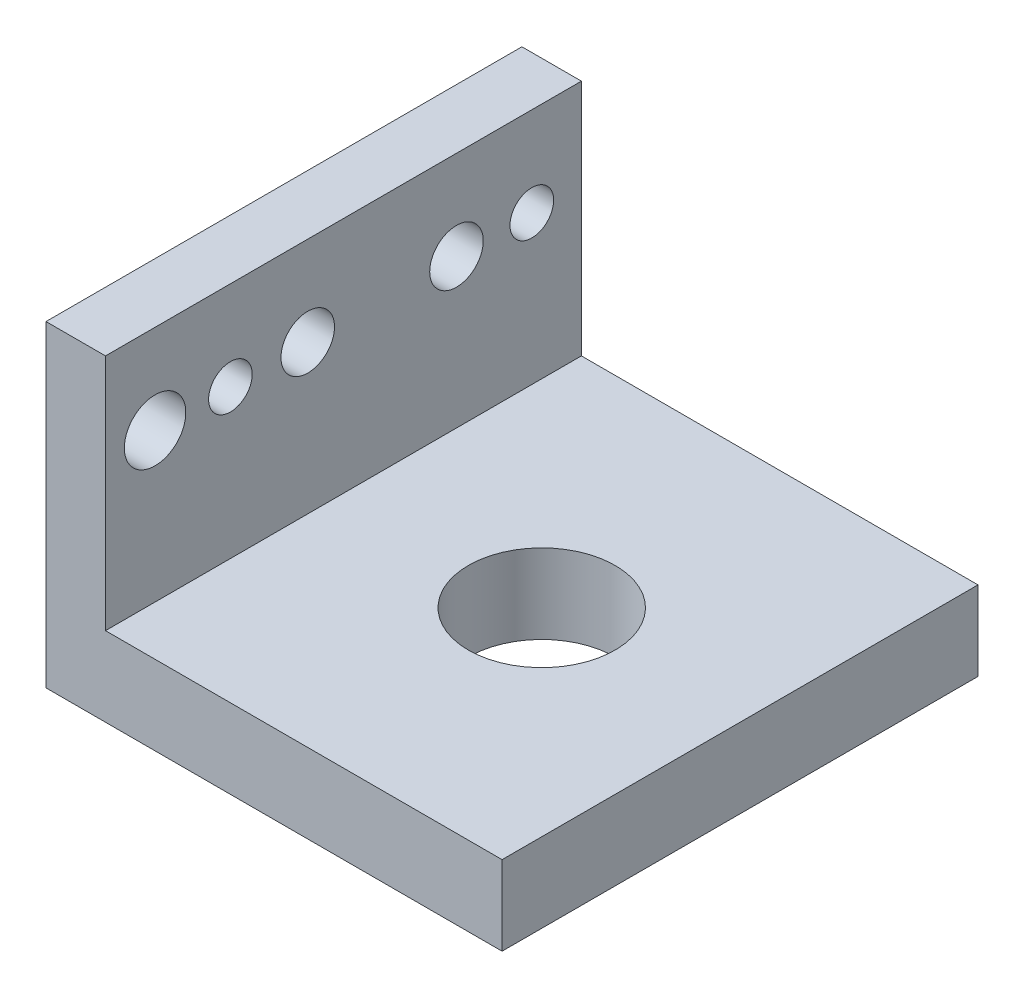
ISO-10303-21;
HEADER;
FILE_DESCRIPTION(('STEP AP214'),'2;1');
FILE_NAME('part.step','',(''),(''),'','','');
FILE_SCHEMA(('AUTOMOTIVE_DESIGN { 1 0 10303 214 1 1 1 1 }'));
ENDSEC;
DATA;
#1=APPLICATION_CONTEXT('core data for automotive mechanical design processes');
#2=APPLICATION_PROTOCOL_DEFINITION('international standard','automotive_design',2000,#1);
#3=PRODUCT_CONTEXT('',#1,'mechanical');
#4=PRODUCT('Part','Part','',(#3));
#5=PRODUCT_RELATED_PRODUCT_CATEGORY('part','',(#4));
#6=PRODUCT_DEFINITION_FORMATION('','',#4);
#7=PRODUCT_DEFINITION_CONTEXT('part definition',#1,'design');
#8=PRODUCT_DEFINITION('design','',#6,#7);
#9=PRODUCT_DEFINITION_SHAPE('','',#8);
#10=(LENGTH_UNIT() NAMED_UNIT(*) SI_UNIT(.MILLI.,.METRE.));
#11=(NAMED_UNIT(*) PLANE_ANGLE_UNIT() SI_UNIT($,.RADIAN.));
#12=(NAMED_UNIT(*) SI_UNIT($,.STERADIAN.) SOLID_ANGLE_UNIT());
#13=UNCERTAINTY_MEASURE_WITH_UNIT(LENGTH_MEASURE(1.E-05),#10,'distance_accuracy_value','');
#14=(GEOMETRIC_REPRESENTATION_CONTEXT(3) GLOBAL_UNCERTAINTY_ASSIGNED_CONTEXT((#13)) GLOBAL_UNIT_ASSIGNED_CONTEXT((#10,
#11,#12)) REPRESENTATION_CONTEXT('',''));
#15=CARTESIAN_POINT('',(0.,0.,0.));
#16=DIRECTION('',(0.,0.,1.));
#17=DIRECTION('',(1.,0.,0.));
#18=AXIS2_PLACEMENT_3D('',#15,#16,#17);
#19=CARTESIAN_POINT('',(0.,4.,0.));
#20=DIRECTION('',(0.,-1.,0.));
#21=DIRECTION('',(0.,0.,-1.));
#22=AXIS2_PLACEMENT_3D('',#19,#20,#21);
#23=PLANE('',#22);
#24=DIRECTION('',(0.,0.,1.));
#25=VECTOR('',#24,1.);
#26=CARTESIAN_POINT('',(0.,4.,0.));
#27=LINE('',#26,#25);
#28=CARTESIAN_POINT('',(0.,4.,-24.));
#29=VERTEX_POINT('',#28);
#30=CARTESIAN_POINT('',(0.,4.,0.));
#31=VERTEX_POINT('',#30);
#32=EDGE_CURVE('E71',#29,#31,#27,.T.);
#33=ORIENTED_EDGE('',*,*,#32,.T.);
#34=DIRECTION('',(1.,0.,0.));
#35=VECTOR('',#34,1.);
#36=CARTESIAN_POINT('',(0.,4.,0.));
#37=LINE('',#36,#35);
#38=CARTESIAN_POINT('',(20.,4.,0.));
#39=VERTEX_POINT('',#38);
#40=EDGE_CURVE('E91',#31,#39,#37,.T.);
#41=ORIENTED_EDGE('',*,*,#40,.T.);
#42=DIRECTION('',(0.,0.,-1.));
#43=VECTOR('',#42,1.);
#44=CARTESIAN_POINT('',(20.,4.,0.));
#45=LINE('',#44,#43);
#46=CARTESIAN_POINT('',(20.,4.,-24.));
#47=VERTEX_POINT('',#46);
#48=EDGE_CURVE('E50',#39,#47,#45,.T.);
#49=ORIENTED_EDGE('',*,*,#48,.T.);
#50=DIRECTION('',(-1.,0.,0.));
#51=VECTOR('',#50,1.);
#52=CARTESIAN_POINT('',(0.,4.,-24.));
#53=LINE('',#52,#51);
#54=EDGE_CURVE('E95',#47,#29,#53,.T.);
#55=ORIENTED_EDGE('',*,*,#54,.T.);
#56=EDGE_LOOP('',(#33,#41,#49,#55));
#57=FACE_BOUND('',#56,.T.);
#58=CARTESIAN_POINT('',(10.,4.,-12.));
#59=DIRECTION('',(0.,1.,0.));
#60=DIRECTION('',(0.,0.,1.));
#61=AXIS2_PLACEMENT_3D('',#58,#59,#60);
#62=CIRCLE('',#61,3.7);
#63=CARTESIAN_POINT('',(10.,4.,-8.3));
#64=VERTEX_POINT('',#63);
#65=EDGE_CURVE('E107',#64,#64,#62,.T.);
#66=ORIENTED_EDGE('',*,*,#65,.F.);
#67=EDGE_LOOP('',(#66));
#68=FACE_BOUND('',#67,.T.);
#69=ADVANCED_FACE('F33',(#57,#68),#23,.F.);
#70=CARTESIAN_POINT('',(0.,0.,0.));
#71=DIRECTION('',(0.,-1.,0.));
#72=DIRECTION('',(0.,0.,-1.));
#73=AXIS2_PLACEMENT_3D('',#70,#71,#72);
#74=PLANE('',#73);
#75=DIRECTION('',(1.,0.,0.));
#76=VECTOR('',#75,1.);
#77=CARTESIAN_POINT('',(0.,0.,0.));
#78=LINE('',#77,#76);
#79=CARTESIAN_POINT('',(-3.,0.,0.));
#80=VERTEX_POINT('',#79);
#81=CARTESIAN_POINT('',(20.,0.,0.));
#82=VERTEX_POINT('',#81);
#83=EDGE_CURVE('E62',#80,#82,#78,.T.);
#84=ORIENTED_EDGE('',*,*,#83,.F.);
#85=DIRECTION('',(0.,0.,1.));
#86=VECTOR('',#85,1.);
#87=CARTESIAN_POINT('',(-3.,0.,-24.));
#88=LINE('',#87,#86);
#89=CARTESIAN_POINT('',(-3.,0.,-24.));
#90=VERTEX_POINT('',#89);
#91=EDGE_CURVE('E121',#90,#80,#88,.T.);
#92=ORIENTED_EDGE('',*,*,#91,.F.);
#93=DIRECTION('',(-1.,0.,0.));
#94=VECTOR('',#93,1.);
#95=CARTESIAN_POINT('',(0.,0.,-24.));
#96=LINE('',#95,#94);
#97=CARTESIAN_POINT('',(20.,0.,-24.));
#98=VERTEX_POINT('',#97);
#99=EDGE_CURVE('E96',#98,#90,#96,.T.);
#100=ORIENTED_EDGE('',*,*,#99,.F.);
#101=DIRECTION('',(0.,0.,-1.));
#102=VECTOR('',#101,1.);
#103=CARTESIAN_POINT('',(20.,0.,0.));
#104=LINE('',#103,#102);
#105=EDGE_CURVE('E98',#82,#98,#104,.T.);
#106=ORIENTED_EDGE('',*,*,#105,.F.);
#107=EDGE_LOOP('',(#84,#92,#100,#106));
#108=FACE_BOUND('',#107,.T.);
#109=CARTESIAN_POINT('',(10.,0.,-12.));
#110=DIRECTION('',(0.,1.,0.));
#111=DIRECTION('',(0.,0.,1.));
#112=AXIS2_PLACEMENT_3D('',#109,#110,#111);
#113=CIRCLE('',#112,3.7);
#114=CARTESIAN_POINT('',(10.,0.,-8.3));
#115=VERTEX_POINT('',#114);
#116=EDGE_CURVE('E101',#115,#115,#113,.T.);
#117=ORIENTED_EDGE('',*,*,#116,.T.);
#118=EDGE_LOOP('',(#117));
#119=FACE_BOUND('',#118,.T.);
#120=ADVANCED_FACE('F118',(#108,#119),#74,.T.);
#121=CARTESIAN_POINT('',(0.,4.,0.));
#122=DIRECTION('',(0.,0.,-1.));
#123=DIRECTION('',(-1.,0.,0.));
#124=AXIS2_PLACEMENT_3D('',#121,#122,#123);
#125=PLANE('',#124);
#126=ORIENTED_EDGE('',*,*,#83,.T.);
#127=DIRECTION('',(0.,-1.,0.));
#128=VECTOR('',#127,1.);
#129=CARTESIAN_POINT('',(20.,4.,0.));
#130=LINE('',#129,#128);
#131=EDGE_CURVE('E11',#39,#82,#130,.T.);
#132=ORIENTED_EDGE('',*,*,#131,.F.);
#133=ORIENTED_EDGE('',*,*,#40,.F.);
#134=DIRECTION('',(0.,1.,0.));
#135=VECTOR('',#134,1.);
#136=CARTESIAN_POINT('',(0.,16.,0.));
#137=LINE('',#136,#135);
#138=CARTESIAN_POINT('',(0.,16.,0.));
#139=VERTEX_POINT('',#138);
#140=EDGE_CURVE('E81',#31,#139,#137,.T.);
#141=ORIENTED_EDGE('',*,*,#140,.T.);
#142=DIRECTION('',(1.,0.,0.));
#143=VECTOR('',#142,1.);
#144=CARTESIAN_POINT('',(-3.,16.,0.));
#145=LINE('',#144,#143);
#146=CARTESIAN_POINT('',(-3.,16.,0.));
#147=VERTEX_POINT('',#146);
#148=EDGE_CURVE('E143',#147,#139,#145,.T.);
#149=ORIENTED_EDGE('',*,*,#148,.F.);
#150=DIRECTION('',(0.,1.,0.));
#151=VECTOR('',#150,1.);
#152=CARTESIAN_POINT('',(-3.,16.,0.));
#153=LINE('',#152,#151);
#154=EDGE_CURVE('E125',#80,#147,#153,.T.);
#155=ORIENTED_EDGE('',*,*,#154,.F.);
#156=EDGE_LOOP('',(#126,#132,#133,#141,#149,#155));
#157=FACE_BOUND('',#156,.T.);
#158=ADVANCED_FACE('F35',(#157),#125,.F.);
#159=CARTESIAN_POINT('',(20.,4.,0.));
#160=DIRECTION('',(-1.,0.,0.));
#161=DIRECTION('',(0.,0.,1.));
#162=AXIS2_PLACEMENT_3D('',#159,#160,#161);
#163=PLANE('',#162);
#164=ORIENTED_EDGE('',*,*,#105,.T.);
#165=DIRECTION('',(0.,-1.,0.));
#166=VECTOR('',#165,1.);
#167=CARTESIAN_POINT('',(20.,4.,-24.));
#168=LINE('',#167,#166);
#169=EDGE_CURVE('E42',#47,#98,#168,.T.);
#170=ORIENTED_EDGE('',*,*,#169,.F.);
#171=ORIENTED_EDGE('',*,*,#48,.F.);
#172=ORIENTED_EDGE('',*,*,#131,.T.);
#173=EDGE_LOOP('',(#164,#170,#171,#172));
#174=FACE_BOUND('',#173,.T.);
#175=ADVANCED_FACE('F160',(#174),#163,.F.);
#176=CARTESIAN_POINT('',(0.,4.,-24.));
#177=DIRECTION('',(0.,0.,1.));
#178=DIRECTION('',(1.,0.,0.));
#179=AXIS2_PLACEMENT_3D('',#176,#177,#178);
#180=PLANE('',#179);
#181=ORIENTED_EDGE('',*,*,#99,.T.);
#182=DIRECTION('',(0.,-1.,0.));
#183=VECTOR('',#182,1.);
#184=CARTESIAN_POINT('',(-3.,0.,-24.));
#185=LINE('',#184,#183);
#186=CARTESIAN_POINT('',(-3.,16.,-24.));
#187=VERTEX_POINT('',#186);
#188=EDGE_CURVE('E137',#187,#90,#185,.T.);
#189=ORIENTED_EDGE('',*,*,#188,.F.);
#190=DIRECTION('',(1.,0.,0.));
#191=VECTOR('',#190,1.);
#192=CARTESIAN_POINT('',(-3.,16.,-24.));
#193=LINE('',#192,#191);
#194=CARTESIAN_POINT('',(0.,16.,-24.));
#195=VERTEX_POINT('',#194);
#196=EDGE_CURVE('E138',#187,#195,#193,.T.);
#197=ORIENTED_EDGE('',*,*,#196,.T.);
#198=DIRECTION('',(0.,-1.,0.));
#199=VECTOR('',#198,1.);
#200=CARTESIAN_POINT('',(0.,0.,-24.));
#201=LINE('',#200,#199);
#202=EDGE_CURVE('E126',#195,#29,#201,.T.);
#203=ORIENTED_EDGE('',*,*,#202,.T.);
#204=ORIENTED_EDGE('',*,*,#54,.F.);
#205=ORIENTED_EDGE('',*,*,#169,.T.);
#206=EDGE_LOOP('',(#181,#189,#197,#203,#204,#205));
#207=FACE_BOUND('',#206,.T.);
#208=ADVANCED_FACE('F111',(#207),#180,.F.);
#209=CARTESIAN_POINT('',(10.,4.,-12.));
#210=DIRECTION('',(0.,-1.,0.));
#211=DIRECTION('',(0.,0.,-1.));
#212=AXIS2_PLACEMENT_3D('',#209,#210,#211);
#213=CYLINDRICAL_SURFACE('',#212,3.7);
#214=ORIENTED_EDGE('',*,*,#65,.T.);
#215=EDGE_LOOP('',(#214));
#216=FACE_BOUND('',#215,.T.);
#217=ORIENTED_EDGE('',*,*,#116,.F.);
#218=EDGE_LOOP('',(#217));
#219=FACE_BOUND('',#218,.T.);
#220=ADVANCED_FACE('F150',(#216,#219),#213,.F.);
#221=CARTESIAN_POINT('',(0.,0.,0.));
#222=DIRECTION('',(1.,0.,0.));
#223=DIRECTION('',(0.,0.,-1.));
#224=AXIS2_PLACEMENT_3D('',#221,#222,#223);
#225=PLANE('',#224);
#226=CARTESIAN_POINT('',(0.,11.5,-10.2));
#227=DIRECTION('',(-1.,0.,0.));
#228=DIRECTION('',(0.,0.,1.));
#229=AXIS2_PLACEMENT_3D('',#226,#227,#228);
#230=CIRCLE('',#229,1.35);
#231=CARTESIAN_POINT('',(0.,11.5,-8.85));
#232=VERTEX_POINT('',#231);
#233=EDGE_CURVE('E288',#232,#232,#230,.T.);
#234=ORIENTED_EDGE('',*,*,#233,.T.);
#235=EDGE_LOOP('',(#234));
#236=FACE_BOUND('',#235,.T.);
#237=CARTESIAN_POINT('',(0.,11.5,-6.3));
#238=DIRECTION('',(-1.,0.,0.));
#239=DIRECTION('',(0.,0.,1.));
#240=AXIS2_PLACEMENT_3D('',#237,#238,#239);
#241=CIRCLE('',#240,1.1);
#242=CARTESIAN_POINT('',(0.,11.5,-5.2));
#243=VERTEX_POINT('',#242);
#244=EDGE_CURVE('E296',#243,#243,#241,.T.);
#245=ORIENTED_EDGE('',*,*,#244,.T.);
#246=EDGE_LOOP('',(#245));
#247=FACE_BOUND('',#246,.T.);
#248=CARTESIAN_POINT('',(0.,11.5,-21.5));
#249=DIRECTION('',(-1.,0.,0.));
#250=DIRECTION('',(0.,0.,1.));
#251=AXIS2_PLACEMENT_3D('',#248,#249,#250);
#252=CIRCLE('',#251,1.1);
#253=CARTESIAN_POINT('',(0.,11.5,-20.4));
#254=VERTEX_POINT('',#253);
#255=EDGE_CURVE('E132',#254,#254,#252,.T.);
#256=ORIENTED_EDGE('',*,*,#255,.T.);
#257=EDGE_LOOP('',(#256));
#258=FACE_BOUND('',#257,.T.);
#259=CARTESIAN_POINT('',(0.,11.5,-17.7));
#260=DIRECTION('',(-1.,0.,0.));
#261=DIRECTION('',(0.,0.,1.));
#262=AXIS2_PLACEMENT_3D('',#259,#260,#261);
#263=CIRCLE('',#262,1.35);
#264=CARTESIAN_POINT('',(0.,11.5,-16.35));
#265=VERTEX_POINT('',#264);
#266=EDGE_CURVE('E302',#265,#265,#263,.T.);
#267=ORIENTED_EDGE('',*,*,#266,.T.);
#268=EDGE_LOOP('',(#267));
#269=FACE_BOUND('',#268,.T.);
#270=CARTESIAN_POINT('',(0.,11.5,-2.5));
#271=DIRECTION('',(-1.,0.,0.));
#272=DIRECTION('',(0.,0.,1.));
#273=AXIS2_PLACEMENT_3D('',#270,#271,#272);
#274=CIRCLE('',#273,1.55);
#275=CARTESIAN_POINT('',(0.,11.5,-0.95));
#276=VERTEX_POINT('',#275);
#277=EDGE_CURVE('E290',#276,#276,#274,.T.);
#278=ORIENTED_EDGE('',*,*,#277,.T.);
#279=EDGE_LOOP('',(#278));
#280=FACE_BOUND('',#279,.T.);
#281=ORIENTED_EDGE('',*,*,#32,.F.);
#282=ORIENTED_EDGE('',*,*,#202,.F.);
#283=DIRECTION('',(0.,0.,-1.));
#284=VECTOR('',#283,1.);
#285=CARTESIAN_POINT('',(0.,16.,-24.));
#286=LINE('',#285,#284);
#287=EDGE_CURVE('E86',#139,#195,#286,.T.);
#288=ORIENTED_EDGE('',*,*,#287,.F.);
#289=ORIENTED_EDGE('',*,*,#140,.F.);
#290=EDGE_LOOP('',(#281,#282,#288,#289));
#291=FACE_BOUND('',#290,.T.);
#292=ADVANCED_FACE('F83',(#236,#247,#258,#269,#280,#291),#225,.T.);
#293=CARTESIAN_POINT('',(-3.,0.,0.));
#294=DIRECTION('',(1.,0.,0.));
#295=DIRECTION('',(0.,0.,-1.));
#296=AXIS2_PLACEMENT_3D('',#293,#294,#295);
#297=PLANE('',#296);
#298=ORIENTED_EDGE('',*,*,#91,.T.);
#299=ORIENTED_EDGE('',*,*,#154,.T.);
#300=DIRECTION('',(0.,0.,-1.));
#301=VECTOR('',#300,1.);
#302=CARTESIAN_POINT('',(-3.,16.,-24.));
#303=LINE('',#302,#301);
#304=EDGE_CURVE('E128',#147,#187,#303,.T.);
#305=ORIENTED_EDGE('',*,*,#304,.T.);
#306=ORIENTED_EDGE('',*,*,#188,.T.);
#307=EDGE_LOOP('',(#298,#299,#305,#306));
#308=FACE_BOUND('',#307,.T.);
#309=CARTESIAN_POINT('',(-3.,11.5,-21.5));
#310=DIRECTION('',(-1.,0.,0.));
#311=DIRECTION('',(0.,0.,1.));
#312=AXIS2_PLACEMENT_3D('',#309,#310,#311);
#313=CIRCLE('',#312,1.1);
#314=CARTESIAN_POINT('',(-3.,11.5,-20.4));
#315=VERTEX_POINT('',#314);
#316=EDGE_CURVE('E89',#315,#315,#313,.T.);
#317=ORIENTED_EDGE('',*,*,#316,.F.);
#318=EDGE_LOOP('',(#317));
#319=FACE_BOUND('',#318,.T.);
#320=CARTESIAN_POINT('',(-3.,11.5,-17.7));
#321=DIRECTION('',(-1.,0.,0.));
#322=DIRECTION('',(0.,0.,1.));
#323=AXIS2_PLACEMENT_3D('',#320,#321,#322);
#324=CIRCLE('',#323,1.35);
#325=CARTESIAN_POINT('',(-3.,11.5,-16.35));
#326=VERTEX_POINT('',#325);
#327=EDGE_CURVE('E305',#326,#326,#324,.T.);
#328=ORIENTED_EDGE('',*,*,#327,.F.);
#329=EDGE_LOOP('',(#328));
#330=FACE_BOUND('',#329,.T.);
#331=CARTESIAN_POINT('',(-3.,11.5,-6.3));
#332=DIRECTION('',(-1.,0.,0.));
#333=DIRECTION('',(0.,0.,1.));
#334=AXIS2_PLACEMENT_3D('',#331,#332,#333);
#335=CIRCLE('',#334,1.1);
#336=CARTESIAN_POINT('',(-3.,11.5,-5.2));
#337=VERTEX_POINT('',#336);
#338=EDGE_CURVE('E299',#337,#337,#335,.T.);
#339=ORIENTED_EDGE('',*,*,#338,.F.);
#340=EDGE_LOOP('',(#339));
#341=FACE_BOUND('',#340,.T.);
#342=CARTESIAN_POINT('',(-3.,11.5,-2.5));
#343=DIRECTION('',(-1.,0.,0.));
#344=DIRECTION('',(0.,0.,1.));
#345=AXIS2_PLACEMENT_3D('',#342,#343,#344);
#346=CIRCLE('',#345,1.55);
#347=CARTESIAN_POINT('',(-3.,11.5,-0.95));
#348=VERTEX_POINT('',#347);
#349=EDGE_CURVE('E293',#348,#348,#346,.T.);
#350=ORIENTED_EDGE('',*,*,#349,.F.);
#351=EDGE_LOOP('',(#350));
#352=FACE_BOUND('',#351,.T.);
#353=CARTESIAN_POINT('',(-3.,11.5,-10.2));
#354=DIRECTION('',(-1.,0.,0.));
#355=DIRECTION('',(0.,0.,1.));
#356=AXIS2_PLACEMENT_3D('',#353,#354,#355);
#357=CIRCLE('',#356,1.35);
#358=CARTESIAN_POINT('',(-3.,11.5,-8.85));
#359=VERTEX_POINT('',#358);
#360=EDGE_CURVE('E285',#359,#359,#357,.T.);
#361=ORIENTED_EDGE('',*,*,#360,.F.);
#362=EDGE_LOOP('',(#361));
#363=FACE_BOUND('',#362,.T.);
#364=ADVANCED_FACE('F157',(#308,#319,#330,#341,#352,#363),#297,.F.);
#365=CARTESIAN_POINT('',(-3.,16.,-24.));
#366=DIRECTION('',(0.,-1.,0.));
#367=DIRECTION('',(0.,0.,-1.));
#368=AXIS2_PLACEMENT_3D('',#365,#366,#367);
#369=PLANE('',#368);
#370=ORIENTED_EDGE('',*,*,#287,.T.);
#371=ORIENTED_EDGE('',*,*,#196,.F.);
#372=ORIENTED_EDGE('',*,*,#304,.F.);
#373=ORIENTED_EDGE('',*,*,#148,.T.);
#374=EDGE_LOOP('',(#370,#371,#372,#373));
#375=FACE_BOUND('',#374,.T.);
#376=ADVANCED_FACE('F220',(#375),#369,.F.);
#377=CARTESIAN_POINT('',(-3.,11.5,-21.5));
#378=DIRECTION('',(1.,0.,0.));
#379=DIRECTION('',(0.,0.,-1.));
#380=AXIS2_PLACEMENT_3D('',#377,#378,#379);
#381=CYLINDRICAL_SURFACE('',#380,1.1);
#382=ORIENTED_EDGE('',*,*,#316,.T.);
#383=EDGE_LOOP('',(#382));
#384=FACE_BOUND('',#383,.T.);
#385=ORIENTED_EDGE('',*,*,#255,.F.);
#386=EDGE_LOOP('',(#385));
#387=FACE_BOUND('',#386,.T.);
#388=ADVANCED_FACE('F228',(#384,#387),#381,.F.);
#389=CARTESIAN_POINT('',(-3.,11.5,-17.7));
#390=DIRECTION('',(1.,0.,0.));
#391=DIRECTION('',(0.,0.,-1.));
#392=AXIS2_PLACEMENT_3D('',#389,#390,#391);
#393=CYLINDRICAL_SURFACE('',#392,1.35);
#394=ORIENTED_EDGE('',*,*,#327,.T.);
#395=EDGE_LOOP('',(#394));
#396=FACE_BOUND('',#395,.T.);
#397=ORIENTED_EDGE('',*,*,#266,.F.);
#398=EDGE_LOOP('',(#397));
#399=FACE_BOUND('',#398,.T.);
#400=ADVANCED_FACE('F236',(#396,#399),#393,.F.);
#401=CARTESIAN_POINT('',(-3.,11.5,-6.3));
#402=DIRECTION('',(1.,0.,0.));
#403=DIRECTION('',(0.,0.,-1.));
#404=AXIS2_PLACEMENT_3D('',#401,#402,#403);
#405=CYLINDRICAL_SURFACE('',#404,1.1);
#406=ORIENTED_EDGE('',*,*,#338,.T.);
#407=EDGE_LOOP('',(#406));
#408=FACE_BOUND('',#407,.T.);
#409=ORIENTED_EDGE('',*,*,#244,.F.);
#410=EDGE_LOOP('',(#409));
#411=FACE_BOUND('',#410,.T.);
#412=ADVANCED_FACE('F245',(#408,#411),#405,.F.);
#413=CARTESIAN_POINT('',(-3.,11.5,-2.5));
#414=DIRECTION('',(1.,0.,0.));
#415=DIRECTION('',(0.,0.,-1.));
#416=AXIS2_PLACEMENT_3D('',#413,#414,#415);
#417=CYLINDRICAL_SURFACE('',#416,1.55);
#418=ORIENTED_EDGE('',*,*,#349,.T.);
#419=EDGE_LOOP('',(#418));
#420=FACE_BOUND('',#419,.T.);
#421=ORIENTED_EDGE('',*,*,#277,.F.);
#422=EDGE_LOOP('',(#421));
#423=FACE_BOUND('',#422,.T.);
#424=ADVANCED_FACE('F254',(#420,#423),#417,.F.);
#425=CARTESIAN_POINT('',(-3.,11.5,-10.2));
#426=DIRECTION('',(1.,0.,0.));
#427=DIRECTION('',(0.,0.,-1.));
#428=AXIS2_PLACEMENT_3D('',#425,#426,#427);
#429=CYLINDRICAL_SURFACE('',#428,1.35);
#430=ORIENTED_EDGE('',*,*,#360,.T.);
#431=EDGE_LOOP('',(#430));
#432=FACE_BOUND('',#431,.T.);
#433=ORIENTED_EDGE('',*,*,#233,.F.);
#434=EDGE_LOOP('',(#433));
#435=FACE_BOUND('',#434,.T.);
#436=ADVANCED_FACE('F263',(#432,#435),#429,.F.);
#437=CLOSED_SHELL('',(#69,#120,#158,#175,#208,#220,#292,#364,#376,#388,#400,#412,#424,#436));
#438=MANIFOLD_SOLID_BREP('B2',#437);
#439=ADVANCED_BREP_SHAPE_REPRESENTATION('',(#18,#438),#14);
#440=SHAPE_DEFINITION_REPRESENTATION(#9,#439);
ENDSEC;
END-ISO-10303-21;
